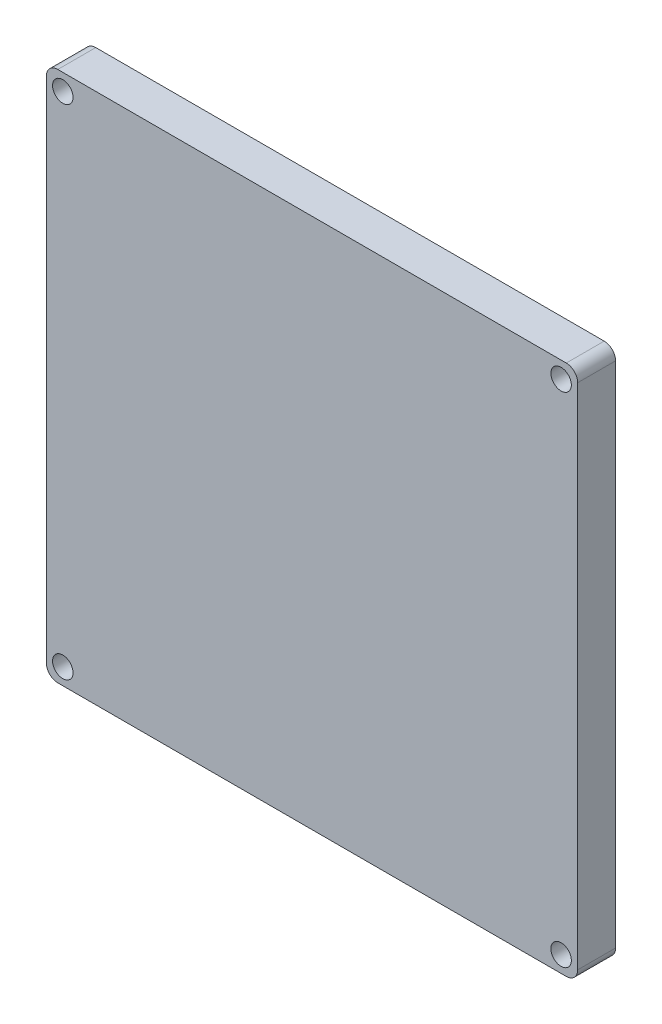
ISO-10303-21;
HEADER;
FILE_DESCRIPTION(('STEP AP214'),'2;1');
FILE_NAME('part.step','',(''),(''),'','','');
FILE_SCHEMA(('AUTOMOTIVE_DESIGN { 1 0 10303 214 1 1 1 1 }'));
ENDSEC;
DATA;
#1=APPLICATION_CONTEXT('core data for automotive mechanical design processes');
#2=APPLICATION_PROTOCOL_DEFINITION('international standard','automotive_design',2000,#1);
#3=PRODUCT_CONTEXT('',#1,'mechanical');
#4=PRODUCT('Part','Part','',(#3));
#5=PRODUCT_RELATED_PRODUCT_CATEGORY('part','',(#4));
#6=PRODUCT_DEFINITION_FORMATION('','',#4);
#7=PRODUCT_DEFINITION_CONTEXT('part definition',#1,'design');
#8=PRODUCT_DEFINITION('design','',#6,#7);
#9=PRODUCT_DEFINITION_SHAPE('','',#8);
#10=(LENGTH_UNIT() NAMED_UNIT(*) SI_UNIT(.MILLI.,.METRE.));
#11=(NAMED_UNIT(*) PLANE_ANGLE_UNIT() SI_UNIT($,.RADIAN.));
#12=(NAMED_UNIT(*) SI_UNIT($,.STERADIAN.) SOLID_ANGLE_UNIT());
#13=UNCERTAINTY_MEASURE_WITH_UNIT(LENGTH_MEASURE(1.E-05),#10,'distance_accuracy_value','');
#14=(GEOMETRIC_REPRESENTATION_CONTEXT(3) GLOBAL_UNCERTAINTY_ASSIGNED_CONTEXT((#13)) GLOBAL_UNIT_ASSIGNED_CONTEXT((#10,
#11,#12)) REPRESENTATION_CONTEXT('',''));
#15=CARTESIAN_POINT('',(0.,0.,0.));
#16=DIRECTION('',(0.,0.,1.));
#17=DIRECTION('',(1.,0.,0.));
#18=AXIS2_PLACEMENT_3D('',#15,#16,#17);
#19=CARTESIAN_POINT('',(0.,0.,0.));
#20=DIRECTION('',(0.,0.,1.));
#21=DIRECTION('',(1.,0.,0.));
#22=AXIS2_PLACEMENT_3D('',#19,#20,#21);
#23=PLANE('',#22);
#24=CARTESIAN_POINT('',(32.82,32.82,0.));
#25=DIRECTION('',(0.,0.,1.));
#26=DIRECTION('',(1.,0.,0.));
#27=AXIS2_PLACEMENT_3D('',#24,#25,#26);
#28=CIRCLE('',#27,1.35);
#29=CARTESIAN_POINT('',(34.17,32.82,0.));
#30=VERTEX_POINT('',#29);
#31=EDGE_CURVE('E155',#30,#30,#28,.T.);
#32=ORIENTED_EDGE('',*,*,#31,.T.);
#33=EDGE_LOOP('',(#32));
#34=FACE_BOUND('',#33,.T.);
#35=CARTESIAN_POINT('',(32.82,-32.84,0.));
#36=DIRECTION('',(0.,0.,1.));
#37=DIRECTION('',(1.,0.,0.));
#38=AXIS2_PLACEMENT_3D('',#35,#36,#37);
#39=CIRCLE('',#38,1.35);
#40=CARTESIAN_POINT('',(34.17,-32.84,0.));
#41=VERTEX_POINT('',#40);
#42=EDGE_CURVE('E168',#41,#41,#39,.T.);
#43=ORIENTED_EDGE('',*,*,#42,.T.);
#44=EDGE_LOOP('',(#43));
#45=FACE_BOUND('',#44,.T.);
#46=CARTESIAN_POINT('',(-32.84,-32.84,0.));
#47=DIRECTION('',(0.,0.,1.));
#48=DIRECTION('',(1.,0.,0.));
#49=AXIS2_PLACEMENT_3D('',#46,#47,#48);
#50=CIRCLE('',#49,1.35);
#51=CARTESIAN_POINT('',(-31.49,-32.84,0.));
#52=VERTEX_POINT('',#51);
#53=EDGE_CURVE('E174',#52,#52,#50,.T.);
#54=ORIENTED_EDGE('',*,*,#53,.T.);
#55=EDGE_LOOP('',(#54));
#56=FACE_BOUND('',#55,.T.);
#57=CARTESIAN_POINT('',(-32.84,32.82,0.));
#58=DIRECTION('',(0.,0.,1.));
#59=DIRECTION('',(1.,0.,0.));
#60=AXIS2_PLACEMENT_3D('',#57,#58,#59);
#61=CIRCLE('',#60,1.35);
#62=CARTESIAN_POINT('',(-31.49,32.82,0.));
#63=VERTEX_POINT('',#62);
#64=EDGE_CURVE('E182',#63,#63,#61,.T.);
#65=ORIENTED_EDGE('',*,*,#64,.T.);
#66=EDGE_LOOP('',(#65));
#67=FACE_BOUND('',#66,.T.);
#68=DIRECTION('',(0.,1.,0.));
#69=VECTOR('',#68,1.);
#70=CARTESIAN_POINT('',(-13.3790654505187,-35.,0.));
#71=LINE('',#70,#69);
#72=CARTESIAN_POINT('',(-13.3790654505187,-35.,0.));
#73=VERTEX_POINT('',#72);
#74=CARTESIAN_POINT('',(-13.3790654505187,-15.3936994320391,0.));
#75=VERTEX_POINT('',#74);
#76=EDGE_CURVE('E153',#73,#75,#71,.T.);
#77=ORIENTED_EDGE('',*,*,#76,.F.);
#78=DIRECTION('',(1.,0.,0.));
#79=VECTOR('',#78,1.);
#80=CARTESIAN_POINT('',(-35.,-35.,0.));
#81=LINE('',#80,#79);
#82=CARTESIAN_POINT('',(-33.5,-35.,0.));
#83=VERTEX_POINT('',#82);
#84=EDGE_CURVE('E199',#83,#73,#81,.T.);
#85=ORIENTED_EDGE('',*,*,#84,.F.);
#86=CARTESIAN_POINT('',(-33.5,-33.5,0.));
#87=DIRECTION('',(0.,0.,1.));
#88=DIRECTION('',(1.,0.,0.));
#89=AXIS2_PLACEMENT_3D('',#86,#87,#88);
#90=CIRCLE('',#89,1.5);
#91=CARTESIAN_POINT('',(-35.,-33.5,0.));
#92=VERTEX_POINT('',#91);
#93=EDGE_CURVE('E235',#83,#92,#90,.F.);
#94=ORIENTED_EDGE('',*,*,#93,.T.);
#95=DIRECTION('',(0.,-1.,0.));
#96=VECTOR('',#95,1.);
#97=CARTESIAN_POINT('',(-35.,35.,0.));
#98=LINE('',#97,#96);
#99=CARTESIAN_POINT('',(-35.,33.5,0.));
#100=VERTEX_POINT('',#99);
#101=EDGE_CURVE('E219',#100,#92,#98,.T.);
#102=ORIENTED_EDGE('',*,*,#101,.F.);
#103=CARTESIAN_POINT('',(-33.5,33.5,0.));
#104=DIRECTION('',(0.,0.,1.));
#105=DIRECTION('',(1.,0.,0.));
#106=AXIS2_PLACEMENT_3D('',#103,#104,#105);
#107=CIRCLE('',#106,1.5);
#108=CARTESIAN_POINT('',(-33.5,35.,0.));
#109=VERTEX_POINT('',#108);
#110=EDGE_CURVE('E232',#100,#109,#107,.F.);
#111=ORIENTED_EDGE('',*,*,#110,.T.);
#112=DIRECTION('',(-1.,0.,0.));
#113=VECTOR('',#112,1.);
#114=CARTESIAN_POINT('',(-35.,35.,0.));
#115=LINE('',#114,#113);
#116=CARTESIAN_POINT('',(33.5,35.,0.));
#117=VERTEX_POINT('',#116);
#118=EDGE_CURVE('E215',#117,#109,#115,.T.);
#119=ORIENTED_EDGE('',*,*,#118,.F.);
#120=CARTESIAN_POINT('',(33.5,33.5,0.));
#121=DIRECTION('',(0.,0.,1.));
#122=DIRECTION('',(1.,0.,0.));
#123=AXIS2_PLACEMENT_3D('',#120,#121,#122);
#124=CIRCLE('',#123,1.5);
#125=CARTESIAN_POINT('',(35.,33.5,0.));
#126=VERTEX_POINT('',#125);
#127=EDGE_CURVE('E241',#117,#126,#124,.F.);
#128=ORIENTED_EDGE('',*,*,#127,.T.);
#129=DIRECTION('',(0.,1.,0.));
#130=VECTOR('',#129,1.);
#131=CARTESIAN_POINT('',(35.,35.,0.));
#132=LINE('',#131,#130);
#133=CARTESIAN_POINT('',(35.,-33.5,0.));
#134=VERTEX_POINT('',#133);
#135=EDGE_CURVE('E190',#134,#126,#132,.T.);
#136=ORIENTED_EDGE('',*,*,#135,.F.);
#137=CARTESIAN_POINT('',(33.5,-33.5,0.));
#138=DIRECTION('',(0.,0.,1.));
#139=DIRECTION('',(1.,0.,0.));
#140=AXIS2_PLACEMENT_3D('',#137,#138,#139);
#141=CIRCLE('',#140,1.5);
#142=CARTESIAN_POINT('',(33.5,-35.,0.));
#143=VERTEX_POINT('',#142);
#144=EDGE_CURVE('E238',#134,#143,#141,.F.);
#145=ORIENTED_EDGE('',*,*,#144,.T.);
#146=CARTESIAN_POINT('',(10.9806147739191,-35.,0.));
#147=VERTEX_POINT('',#146);
#148=EDGE_CURVE('E63',#147,#143,#81,.T.);
#149=ORIENTED_EDGE('',*,*,#148,.F.);
#150=DIRECTION('',(0.,-1.,0.));
#151=VECTOR('',#150,1.);
#152=CARTESIAN_POINT('',(10.9806147739191,-35.,0.));
#153=LINE('',#152,#151);
#154=CARTESIAN_POINT('',(10.9806147739191,-15.3936994320391,0.));
#155=VERTEX_POINT('',#154);
#156=EDGE_CURVE('E150',#155,#147,#153,.T.);
#157=ORIENTED_EDGE('',*,*,#156,.F.);
#158=DIRECTION('',(1.,0.,0.));
#159=VECTOR('',#158,1.);
#160=CARTESIAN_POINT('',(-13.3790654505187,-15.3936994320391,0.));
#161=LINE('',#160,#159);
#162=EDGE_CURVE('E57',#75,#155,#161,.T.);
#163=ORIENTED_EDGE('',*,*,#162,.F.);
#164=EDGE_LOOP('',(#77,#85,#94,#102,#111,#119,#128,#136,#145,#149,#157,#163));
#165=FACE_BOUND('',#164,.T.);
#166=ADVANCED_FACE('F41',(#34,#45,#56,#67,#165),#23,.F.);
#167=CARTESIAN_POINT('',(0.,0.,5.));
#168=DIRECTION('',(0.,0.,1.));
#169=DIRECTION('',(1.,0.,0.));
#170=AXIS2_PLACEMENT_3D('',#167,#168,#169);
#171=PLANE('',#170);
#172=CARTESIAN_POINT('',(32.82,-32.84,5.));
#173=DIRECTION('',(0.,0.,1.));
#174=DIRECTION('',(1.,0.,0.));
#175=AXIS2_PLACEMENT_3D('',#172,#173,#174);
#176=CIRCLE('',#175,1.35);
#177=CARTESIAN_POINT('',(34.17,-32.84,5.));
#178=VERTEX_POINT('',#177);
#179=EDGE_CURVE('E170',#178,#178,#176,.T.);
#180=ORIENTED_EDGE('',*,*,#179,.F.);
#181=EDGE_LOOP('',(#180));
#182=FACE_BOUND('',#181,.T.);
#183=CARTESIAN_POINT('',(-32.84,32.82,5.));
#184=DIRECTION('',(0.,0.,1.));
#185=DIRECTION('',(1.,0.,0.));
#186=AXIS2_PLACEMENT_3D('',#183,#184,#185);
#187=CIRCLE('',#186,1.35);
#188=CARTESIAN_POINT('',(-31.49,32.82,5.));
#189=VERTEX_POINT('',#188);
#190=EDGE_CURVE('E186',#189,#189,#187,.T.);
#191=ORIENTED_EDGE('',*,*,#190,.F.);
#192=EDGE_LOOP('',(#191));
#193=FACE_BOUND('',#192,.T.);
#194=DIRECTION('',(0.,1.,0.));
#195=VECTOR('',#194,1.);
#196=CARTESIAN_POINT('',(35.,35.,5.));
#197=LINE('',#196,#195);
#198=CARTESIAN_POINT('',(35.,-33.5,5.));
#199=VERTEX_POINT('',#198);
#200=CARTESIAN_POINT('',(35.,33.5,5.));
#201=VERTEX_POINT('',#200);
#202=EDGE_CURVE('E194',#199,#201,#197,.T.);
#203=ORIENTED_EDGE('',*,*,#202,.T.);
#204=CARTESIAN_POINT('',(33.5,33.5,5.));
#205=DIRECTION('',(0.,0.,1.));
#206=DIRECTION('',(1.,0.,0.));
#207=AXIS2_PLACEMENT_3D('',#204,#205,#206);
#208=CIRCLE('',#207,1.5);
#209=CARTESIAN_POINT('',(33.5,35.,5.));
#210=VERTEX_POINT('',#209);
#211=EDGE_CURVE('E260',#201,#210,#208,.T.);
#212=ORIENTED_EDGE('',*,*,#211,.T.);
#213=DIRECTION('',(-1.,0.,0.));
#214=VECTOR('',#213,1.);
#215=CARTESIAN_POINT('',(-35.,35.,5.));
#216=LINE('',#215,#214);
#217=CARTESIAN_POINT('',(-33.5,35.,5.));
#218=VERTEX_POINT('',#217);
#219=EDGE_CURVE('E198',#210,#218,#216,.T.);
#220=ORIENTED_EDGE('',*,*,#219,.T.);
#221=CARTESIAN_POINT('',(-33.5,33.5,5.));
#222=DIRECTION('',(0.,0.,1.));
#223=DIRECTION('',(1.,0.,0.));
#224=AXIS2_PLACEMENT_3D('',#221,#222,#223);
#225=CIRCLE('',#224,1.5);
#226=CARTESIAN_POINT('',(-35.,33.5,5.));
#227=VERTEX_POINT('',#226);
#228=EDGE_CURVE('E251',#218,#227,#225,.T.);
#229=ORIENTED_EDGE('',*,*,#228,.T.);
#230=DIRECTION('',(0.,-1.,0.));
#231=VECTOR('',#230,1.);
#232=CARTESIAN_POINT('',(-35.,35.,5.));
#233=LINE('',#232,#231);
#234=CARTESIAN_POINT('',(-35.,-33.5,5.));
#235=VERTEX_POINT('',#234);
#236=EDGE_CURVE('E203',#227,#235,#233,.T.);
#237=ORIENTED_EDGE('',*,*,#236,.T.);
#238=CARTESIAN_POINT('',(-33.5,-33.5,5.));
#239=DIRECTION('',(0.,0.,1.));
#240=DIRECTION('',(1.,0.,0.));
#241=AXIS2_PLACEMENT_3D('',#238,#239,#240);
#242=CIRCLE('',#241,1.5);
#243=CARTESIAN_POINT('',(-33.5,-35.,5.));
#244=VERTEX_POINT('',#243);
#245=EDGE_CURVE('E254',#235,#244,#242,.T.);
#246=ORIENTED_EDGE('',*,*,#245,.T.);
#247=DIRECTION('',(1.,0.,0.));
#248=VECTOR('',#247,1.);
#249=CARTESIAN_POINT('',(-35.,-35.,5.));
#250=LINE('',#249,#248);
#251=CARTESIAN_POINT('',(33.5,-35.,5.));
#252=VERTEX_POINT('',#251);
#253=EDGE_CURVE('E207',#244,#252,#250,.T.);
#254=ORIENTED_EDGE('',*,*,#253,.T.);
#255=CARTESIAN_POINT('',(33.5,-33.5,5.));
#256=DIRECTION('',(0.,0.,1.));
#257=DIRECTION('',(1.,0.,0.));
#258=AXIS2_PLACEMENT_3D('',#255,#256,#257);
#259=CIRCLE('',#258,1.5);
#260=EDGE_CURVE('E257',#252,#199,#259,.T.);
#261=ORIENTED_EDGE('',*,*,#260,.T.);
#262=EDGE_LOOP('',(#203,#212,#220,#229,#237,#246,#254,#261));
#263=FACE_BOUND('',#262,.T.);
#264=CARTESIAN_POINT('',(-32.84,-32.84,5.));
#265=DIRECTION('',(0.,0.,1.));
#266=DIRECTION('',(1.,0.,0.));
#267=AXIS2_PLACEMENT_3D('',#264,#265,#266);
#268=CIRCLE('',#267,1.35);
#269=CARTESIAN_POINT('',(-31.49,-32.84,5.));
#270=VERTEX_POINT('',#269);
#271=EDGE_CURVE('E178',#270,#270,#268,.T.);
#272=ORIENTED_EDGE('',*,*,#271,.F.);
#273=EDGE_LOOP('',(#272));
#274=FACE_BOUND('',#273,.T.);
#275=CARTESIAN_POINT('',(32.82,32.82,5.));
#276=DIRECTION('',(0.,0.,1.));
#277=DIRECTION('',(1.,0.,0.));
#278=AXIS2_PLACEMENT_3D('',#275,#276,#277);
#279=CIRCLE('',#278,1.35);
#280=CARTESIAN_POINT('',(34.17,32.82,5.));
#281=VERTEX_POINT('',#280);
#282=EDGE_CURVE('E160',#281,#281,#279,.T.);
#283=ORIENTED_EDGE('',*,*,#282,.F.);
#284=EDGE_LOOP('',(#283));
#285=FACE_BOUND('',#284,.T.);
#286=ADVANCED_FACE('F291',(#182,#193,#263,#274,#285),#171,.T.);
#287=CARTESIAN_POINT('',(35.,35.,5.));
#288=DIRECTION('',(-1.,0.,0.));
#289=DIRECTION('',(0.,-1.,0.));
#290=AXIS2_PLACEMENT_3D('',#287,#288,#289);
#291=PLANE('',#290);
#292=ORIENTED_EDGE('',*,*,#135,.T.);
#293=DIRECTION('',(0.,0.,-1.));
#294=VECTOR('',#293,1.);
#295=CARTESIAN_POINT('',(35.,33.5,5.));
#296=LINE('',#295,#294);
#297=EDGE_CURVE('E248',#126,#201,#296,.F.);
#298=ORIENTED_EDGE('',*,*,#297,.T.);
#299=ORIENTED_EDGE('',*,*,#202,.F.);
#300=DIRECTION('',(0.,0.,-1.));
#301=VECTOR('',#300,1.);
#302=CARTESIAN_POINT('',(35.,-33.5,5.));
#303=LINE('',#302,#301);
#304=EDGE_CURVE('E244',#199,#134,#303,.T.);
#305=ORIENTED_EDGE('',*,*,#304,.T.);
#306=EDGE_LOOP('',(#292,#298,#299,#305));
#307=FACE_BOUND('',#306,.T.);
#308=ADVANCED_FACE('F299',(#307),#291,.F.);
#309=CARTESIAN_POINT('',(-35.,35.,5.));
#310=DIRECTION('',(0.,-1.,0.));
#311=DIRECTION('',(0.,0.,-1.));
#312=AXIS2_PLACEMENT_3D('',#309,#310,#311);
#313=PLANE('',#312);
#314=ORIENTED_EDGE('',*,*,#219,.F.);
#315=DIRECTION('',(0.,0.,-1.));
#316=VECTOR('',#315,1.);
#317=CARTESIAN_POINT('',(33.5,35.,5.));
#318=LINE('',#317,#316);
#319=EDGE_CURVE('E228',#210,#117,#318,.T.);
#320=ORIENTED_EDGE('',*,*,#319,.T.);
#321=ORIENTED_EDGE('',*,*,#118,.T.);
#322=DIRECTION('',(0.,0.,-1.));
#323=VECTOR('',#322,1.);
#324=CARTESIAN_POINT('',(-33.5,35.,5.));
#325=LINE('',#324,#323);
#326=EDGE_CURVE('E211',#109,#218,#325,.F.);
#327=ORIENTED_EDGE('',*,*,#326,.T.);
#328=EDGE_LOOP('',(#314,#320,#321,#327));
#329=FACE_BOUND('',#328,.T.);
#330=ADVANCED_FACE('F307',(#329),#313,.F.);
#331=CARTESIAN_POINT('',(-35.,35.,5.));
#332=DIRECTION('',(1.,0.,0.));
#333=DIRECTION('',(0.,1.,0.));
#334=AXIS2_PLACEMENT_3D('',#331,#332,#333);
#335=PLANE('',#334);
#336=ORIENTED_EDGE('',*,*,#101,.T.);
#337=DIRECTION('',(0.,0.,-1.));
#338=VECTOR('',#337,1.);
#339=CARTESIAN_POINT('',(-35.,-33.5,5.));
#340=LINE('',#339,#338);
#341=EDGE_CURVE('E11',#92,#235,#340,.F.);
#342=ORIENTED_EDGE('',*,*,#341,.T.);
#343=ORIENTED_EDGE('',*,*,#236,.F.);
#344=DIRECTION('',(0.,0.,-1.));
#345=VECTOR('',#344,1.);
#346=CARTESIAN_POINT('',(-35.,33.5,5.));
#347=LINE('',#346,#345);
#348=EDGE_CURVE('E50',#227,#100,#347,.T.);
#349=ORIENTED_EDGE('',*,*,#348,.T.);
#350=EDGE_LOOP('',(#336,#342,#343,#349));
#351=FACE_BOUND('',#350,.T.);
#352=ADVANCED_FACE('F275',(#351),#335,.F.);
#353=CARTESIAN_POINT('',(-35.,-35.,5.));
#354=DIRECTION('',(0.,1.,0.));
#355=DIRECTION('',(0.,0.,1.));
#356=AXIS2_PLACEMENT_3D('',#353,#354,#355);
#357=PLANE('',#356);
#358=ORIENTED_EDGE('',*,*,#84,.T.);
#359=DIRECTION('',(0.,0.,1.));
#360=VECTOR('',#359,1.);
#361=CARTESIAN_POINT('',(-13.3790654505187,-35.,-9.));
#362=LINE('',#361,#360);
#363=CARTESIAN_POINT('',(-13.3790654505187,-35.,-9.));
#364=VERTEX_POINT('',#363);
#365=EDGE_CURVE('E490',#364,#73,#362,.T.);
#366=ORIENTED_EDGE('',*,*,#365,.F.);
#367=DIRECTION('',(-1.,0.,0.));
#368=VECTOR('',#367,1.);
#369=CARTESIAN_POINT('',(-13.3790654505187,-35.,-9.));
#370=LINE('',#369,#368);
#371=CARTESIAN_POINT('',(10.9806147739191,-35.,-9.));
#372=VERTEX_POINT('',#371);
#373=EDGE_CURVE('E145',#372,#364,#370,.T.);
#374=ORIENTED_EDGE('',*,*,#373,.F.);
#375=DIRECTION('',(0.,0.,1.));
#376=VECTOR('',#375,1.);
#377=CARTESIAN_POINT('',(10.9806147739191,-35.,-9.));
#378=LINE('',#377,#376);
#379=EDGE_CURVE('E162',#372,#147,#378,.T.);
#380=ORIENTED_EDGE('',*,*,#379,.T.);
#381=ORIENTED_EDGE('',*,*,#148,.T.);
#382=DIRECTION('',(0.,0.,-1.));
#383=VECTOR('',#382,1.);
#384=CARTESIAN_POINT('',(33.5,-35.,5.));
#385=LINE('',#384,#383);
#386=EDGE_CURVE('E267',#143,#252,#385,.F.);
#387=ORIENTED_EDGE('',*,*,#386,.T.);
#388=ORIENTED_EDGE('',*,*,#253,.F.);
#389=DIRECTION('',(0.,0.,-1.));
#390=VECTOR('',#389,1.);
#391=CARTESIAN_POINT('',(-33.5,-35.,5.));
#392=LINE('',#391,#390);
#393=EDGE_CURVE('E263',#244,#83,#392,.T.);
#394=ORIENTED_EDGE('',*,*,#393,.T.);
#395=EDGE_LOOP('',(#358,#366,#374,#380,#381,#387,#388,#394));
#396=FACE_BOUND('',#395,.T.);
#397=ADVANCED_FACE('F287',(#396),#357,.F.);
#398=CARTESIAN_POINT('',(-32.84,32.82,5.));
#399=DIRECTION('',(0.,0.,-1.));
#400=DIRECTION('',(-1.,0.,0.));
#401=AXIS2_PLACEMENT_3D('',#398,#399,#400);
#402=CYLINDRICAL_SURFACE('',#401,1.35);
#403=ORIENTED_EDGE('',*,*,#190,.T.);
#404=EDGE_LOOP('',(#403));
#405=FACE_BOUND('',#404,.T.);
#406=ORIENTED_EDGE('',*,*,#64,.F.);
#407=EDGE_LOOP('',(#406));
#408=FACE_BOUND('',#407,.T.);
#409=ADVANCED_FACE('F330',(#405,#408),#402,.F.);
#410=CARTESIAN_POINT('',(-32.84,-32.84,5.));
#411=DIRECTION('',(0.,0.,-1.));
#412=DIRECTION('',(-1.,0.,0.));
#413=AXIS2_PLACEMENT_3D('',#410,#411,#412);
#414=CYLINDRICAL_SURFACE('',#413,1.35);
#415=ORIENTED_EDGE('',*,*,#271,.T.);
#416=EDGE_LOOP('',(#415));
#417=FACE_BOUND('',#416,.T.);
#418=ORIENTED_EDGE('',*,*,#53,.F.);
#419=EDGE_LOOP('',(#418));
#420=FACE_BOUND('',#419,.T.);
#421=ADVANCED_FACE('F409',(#417,#420),#414,.F.);
#422=CARTESIAN_POINT('',(32.82,-32.84,5.));
#423=DIRECTION('',(0.,0.,-1.));
#424=DIRECTION('',(-1.,0.,0.));
#425=AXIS2_PLACEMENT_3D('',#422,#423,#424);
#426=CYLINDRICAL_SURFACE('',#425,1.35);
#427=ORIENTED_EDGE('',*,*,#179,.T.);
#428=EDGE_LOOP('',(#427));
#429=FACE_BOUND('',#428,.T.);
#430=ORIENTED_EDGE('',*,*,#42,.F.);
#431=EDGE_LOOP('',(#430));
#432=FACE_BOUND('',#431,.T.);
#433=ADVANCED_FACE('F405',(#429,#432),#426,.F.);
#434=CARTESIAN_POINT('',(32.82,32.82,5.));
#435=DIRECTION('',(0.,0.,-1.));
#436=DIRECTION('',(-1.,0.,0.));
#437=AXIS2_PLACEMENT_3D('',#434,#435,#436);
#438=CYLINDRICAL_SURFACE('',#437,1.35);
#439=ORIENTED_EDGE('',*,*,#282,.T.);
#440=EDGE_LOOP('',(#439));
#441=FACE_BOUND('',#440,.T.);
#442=ORIENTED_EDGE('',*,*,#31,.F.);
#443=EDGE_LOOP('',(#442));
#444=FACE_BOUND('',#443,.T.);
#445=ADVANCED_FACE('F339',(#441,#444),#438,.F.);
#446=CARTESIAN_POINT('',(33.5,33.5,5.));
#447=DIRECTION('',(0.,0.,-1.));
#448=DIRECTION('',(-1.,0.,0.));
#449=AXIS2_PLACEMENT_3D('',#446,#447,#448);
#450=CYLINDRICAL_SURFACE('',#449,1.5);
#451=ORIENTED_EDGE('',*,*,#211,.F.);
#452=ORIENTED_EDGE('',*,*,#297,.F.);
#453=ORIENTED_EDGE('',*,*,#127,.F.);
#454=ORIENTED_EDGE('',*,*,#319,.F.);
#455=EDGE_LOOP('',(#451,#452,#453,#454));
#456=FACE_BOUND('',#455,.T.);
#457=ADVANCED_FACE('F304',(#456),#450,.T.);
#458=CARTESIAN_POINT('',(33.5,-33.5,5.));
#459=DIRECTION('',(0.,0.,-1.));
#460=DIRECTION('',(-1.,0.,0.));
#461=AXIS2_PLACEMENT_3D('',#458,#459,#460);
#462=CYLINDRICAL_SURFACE('',#461,1.5);
#463=ORIENTED_EDGE('',*,*,#260,.F.);
#464=ORIENTED_EDGE('',*,*,#386,.F.);
#465=ORIENTED_EDGE('',*,*,#144,.F.);
#466=ORIENTED_EDGE('',*,*,#304,.F.);
#467=EDGE_LOOP('',(#463,#464,#465,#466));
#468=FACE_BOUND('',#467,.T.);
#469=ADVANCED_FACE('F296',(#468),#462,.T.);
#470=CARTESIAN_POINT('',(-33.5,-33.5,5.));
#471=DIRECTION('',(0.,0.,-1.));
#472=DIRECTION('',(-1.,0.,0.));
#473=AXIS2_PLACEMENT_3D('',#470,#471,#472);
#474=CYLINDRICAL_SURFACE('',#473,1.5);
#475=ORIENTED_EDGE('',*,*,#245,.F.);
#476=ORIENTED_EDGE('',*,*,#341,.F.);
#477=ORIENTED_EDGE('',*,*,#93,.F.);
#478=ORIENTED_EDGE('',*,*,#393,.F.);
#479=EDGE_LOOP('',(#475,#476,#477,#478));
#480=FACE_BOUND('',#479,.T.);
#481=ADVANCED_FACE('F284',(#480),#474,.T.);
#482=CARTESIAN_POINT('',(-33.5,33.5,5.));
#483=DIRECTION('',(0.,0.,-1.));
#484=DIRECTION('',(-1.,0.,0.));
#485=AXIS2_PLACEMENT_3D('',#482,#483,#484);
#486=CYLINDRICAL_SURFACE('',#485,1.5);
#487=ORIENTED_EDGE('',*,*,#228,.F.);
#488=ORIENTED_EDGE('',*,*,#326,.F.);
#489=ORIENTED_EDGE('',*,*,#110,.F.);
#490=ORIENTED_EDGE('',*,*,#348,.F.);
#491=EDGE_LOOP('',(#487,#488,#489,#490));
#492=FACE_BOUND('',#491,.T.);
#493=ADVANCED_FACE('F43',(#492),#486,.T.);
#494=CARTESIAN_POINT('',(-13.3790654505187,-35.,-9.));
#495=DIRECTION('',(1.,0.,0.));
#496=DIRECTION('',(0.,0.,-1.));
#497=AXIS2_PLACEMENT_3D('',#494,#495,#496);
#498=PLANE('',#497);
#499=ORIENTED_EDGE('',*,*,#76,.T.);
#500=DIRECTION('',(0.,0.,1.));
#501=VECTOR('',#500,1.);
#502=CARTESIAN_POINT('',(-13.3790654505187,-15.3936994320391,-9.));
#503=LINE('',#502,#501);
#504=CARTESIAN_POINT('',(-13.3790654505187,-15.3936994320391,-9.));
#505=VERTEX_POINT('',#504);
#506=EDGE_CURVE('E132',#505,#75,#503,.T.);
#507=ORIENTED_EDGE('',*,*,#506,.F.);
#508=DIRECTION('',(0.,1.,0.));
#509=VECTOR('',#508,1.);
#510=CARTESIAN_POINT('',(-13.3790654505187,-35.,-9.));
#511=LINE('',#510,#509);
#512=EDGE_CURVE('E140',#364,#505,#511,.T.);
#513=ORIENTED_EDGE('',*,*,#512,.F.);
#514=ORIENTED_EDGE('',*,*,#365,.T.);
#515=EDGE_LOOP('',(#499,#507,#513,#514));
#516=FACE_BOUND('',#515,.T.);
#517=ADVANCED_FACE('F152',(#516),#498,.F.);
#518=CARTESIAN_POINT('',(-13.3790654505187,-15.3936994320391,-9.));
#519=DIRECTION('',(0.,-1.,0.));
#520=DIRECTION('',(0.,0.,-1.));
#521=AXIS2_PLACEMENT_3D('',#518,#519,#520);
#522=PLANE('',#521);
#523=ORIENTED_EDGE('',*,*,#162,.T.);
#524=DIRECTION('',(0.,0.,1.));
#525=VECTOR('',#524,1.);
#526=CARTESIAN_POINT('',(10.9806147739191,-15.3936994320391,-9.));
#527=LINE('',#526,#525);
#528=CARTESIAN_POINT('',(10.9806147739191,-15.3936994320391,-9.));
#529=VERTEX_POINT('',#528);
#530=EDGE_CURVE('E135',#529,#155,#527,.T.);
#531=ORIENTED_EDGE('',*,*,#530,.F.);
#532=DIRECTION('',(1.,0.,0.));
#533=VECTOR('',#532,1.);
#534=CARTESIAN_POINT('',(-13.3790654505187,-15.3936994320391,-9.));
#535=LINE('',#534,#533);
#536=EDGE_CURVE('E128',#505,#529,#535,.T.);
#537=ORIENTED_EDGE('',*,*,#536,.F.);
#538=ORIENTED_EDGE('',*,*,#506,.T.);
#539=EDGE_LOOP('',(#523,#531,#537,#538));
#540=FACE_BOUND('',#539,.T.);
#541=ADVANCED_FACE('F130',(#540),#522,.F.);
#542=CARTESIAN_POINT('',(10.9806147739191,-35.,-9.));
#543=DIRECTION('',(-1.,0.,0.));
#544=DIRECTION('',(0.,0.,1.));
#545=AXIS2_PLACEMENT_3D('',#542,#543,#544);
#546=PLANE('',#545);
#547=ORIENTED_EDGE('',*,*,#156,.T.);
#548=ORIENTED_EDGE('',*,*,#379,.F.);
#549=DIRECTION('',(0.,-1.,0.));
#550=VECTOR('',#549,1.);
#551=CARTESIAN_POINT('',(10.9806147739191,-35.,-9.));
#552=LINE('',#551,#550);
#553=EDGE_CURVE('E139',#529,#372,#552,.T.);
#554=ORIENTED_EDGE('',*,*,#553,.F.);
#555=ORIENTED_EDGE('',*,*,#530,.T.);
#556=EDGE_LOOP('',(#547,#548,#554,#555));
#557=FACE_BOUND('',#556,.T.);
#558=ADVANCED_FACE('F381',(#557),#546,.F.);
#559=CARTESIAN_POINT('',(0.,0.,-9.));
#560=DIRECTION('',(0.,0.,-1.));
#561=DIRECTION('',(-1.,0.,0.));
#562=AXIS2_PLACEMENT_3D('',#559,#560,#561);
#563=PLANE('',#562);
#564=ORIENTED_EDGE('',*,*,#512,.T.);
#565=ORIENTED_EDGE('',*,*,#536,.T.);
#566=ORIENTED_EDGE('',*,*,#553,.T.);
#567=ORIENTED_EDGE('',*,*,#373,.T.);
#568=EDGE_LOOP('',(#564,#565,#566,#567));
#569=FACE_BOUND('',#568,.T.);
#570=ADVANCED_FACE('F143',(#569),#563,.T.);
#571=CLOSED_SHELL('',(#166,#286,#308,#330,#352,#397,#409,#421,#433,#445,#457,#469,#481,#493,
#517,#541,#558,#570));
#572=MANIFOLD_SOLID_BREP('B2',#571);
#573=ADVANCED_BREP_SHAPE_REPRESENTATION('',(#18,#572),#14);
#574=SHAPE_DEFINITION_REPRESENTATION(#9,#573);
ENDSEC;
END-ISO-10303-21;
